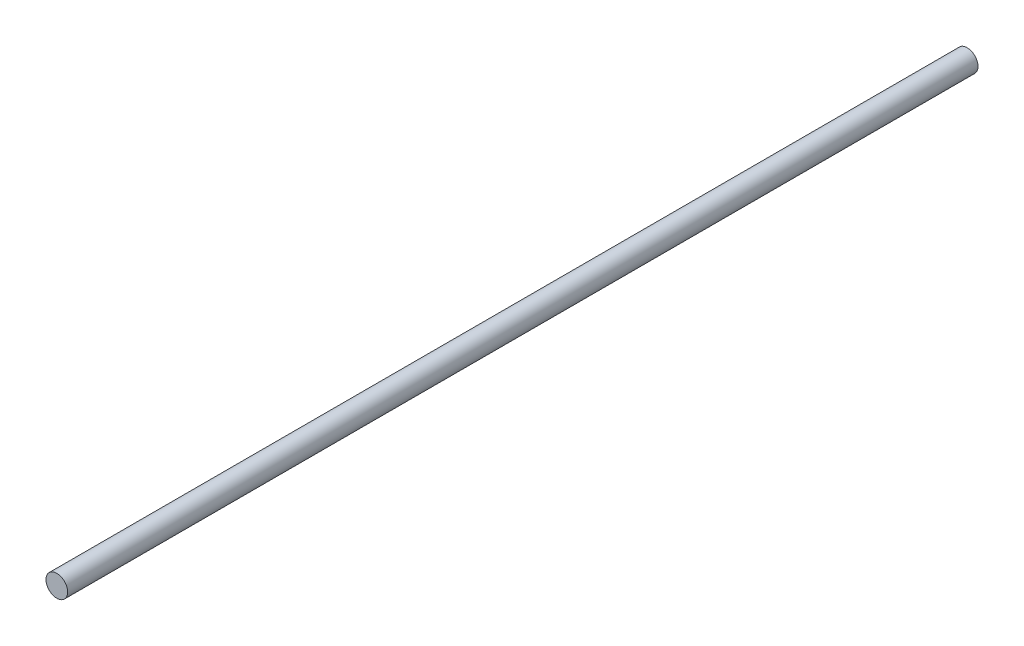
ISO-10303-21;
HEADER;
FILE_DESCRIPTION(('STEP AP214'),'2;1');
FILE_NAME('part.step','',(''),(''),'','','');
FILE_SCHEMA(('AUTOMOTIVE_DESIGN { 1 0 10303 214 1 1 1 1 }'));
ENDSEC;
DATA;
#1=APPLICATION_CONTEXT('core data for automotive mechanical design processes');
#2=APPLICATION_PROTOCOL_DEFINITION('international standard','automotive_design',2000,#1);
#3=PRODUCT_CONTEXT('',#1,'mechanical');
#4=PRODUCT('Part','Part','',(#3));
#5=PRODUCT_RELATED_PRODUCT_CATEGORY('part','',(#4));
#6=PRODUCT_DEFINITION_FORMATION('','',#4);
#7=PRODUCT_DEFINITION_CONTEXT('part definition',#1,'design');
#8=PRODUCT_DEFINITION('design','',#6,#7);
#9=PRODUCT_DEFINITION_SHAPE('','',#8);
#10=(LENGTH_UNIT() NAMED_UNIT(*) SI_UNIT(.MILLI.,.METRE.));
#11=(NAMED_UNIT(*) PLANE_ANGLE_UNIT() SI_UNIT($,.RADIAN.));
#12=(NAMED_UNIT(*) SI_UNIT($,.STERADIAN.) SOLID_ANGLE_UNIT());
#13=UNCERTAINTY_MEASURE_WITH_UNIT(LENGTH_MEASURE(1.E-05),#10,'distance_accuracy_value','');
#14=(GEOMETRIC_REPRESENTATION_CONTEXT(3) GLOBAL_UNCERTAINTY_ASSIGNED_CONTEXT((#13)) GLOBAL_UNIT_ASSIGNED_CONTEXT((#10,
#11,#12)) REPRESENTATION_CONTEXT('',''));
#15=CARTESIAN_POINT('',(0.,0.,0.));
#16=DIRECTION('',(0.,0.,1.));
#17=DIRECTION('',(1.,0.,0.));
#18=AXIS2_PLACEMENT_3D('',#15,#16,#17);
#19=CARTESIAN_POINT('',(0.,0.,373.888));
#20=DIRECTION('',(0.,0.,-1.));
#21=DIRECTION('',(-1.,0.,0.));
#22=AXIS2_PLACEMENT_3D('',#19,#20,#21);
#23=CYLINDRICAL_SURFACE('',#22,4.445);
#24=CARTESIAN_POINT('',(0.,0.,373.888));
#25=DIRECTION('',(0.,0.,1.));
#26=DIRECTION('',(1.,0.,0.));
#27=AXIS2_PLACEMENT_3D('',#24,#25,#26);
#28=CIRCLE('',#27,4.445);
#29=CARTESIAN_POINT('',(4.445,0.,373.888));
#30=VERTEX_POINT('',#29);
#31=EDGE_CURVE('E11',#30,#30,#28,.T.);
#32=ORIENTED_EDGE('',*,*,#31,.F.);
#33=EDGE_LOOP('',(#32));
#34=FACE_BOUND('',#33,.T.);
#35=CARTESIAN_POINT('',(0.,0.,0.));
#36=DIRECTION('',(0.,0.,1.));
#37=DIRECTION('',(1.,0.,0.));
#38=AXIS2_PLACEMENT_3D('',#35,#36,#37);
#39=CIRCLE('',#38,4.445);
#40=CARTESIAN_POINT('',(4.445,0.,0.));
#41=VERTEX_POINT('',#40);
#42=EDGE_CURVE('E51',#41,#41,#39,.T.);
#43=ORIENTED_EDGE('',*,*,#42,.T.);
#44=EDGE_LOOP('',(#43));
#45=FACE_BOUND('',#44,.T.);
#46=ADVANCED_FACE('F48',(#34,#45),#23,.T.);
#47=CARTESIAN_POINT('',(0.,0.,373.888));
#48=DIRECTION('',(0.,0.,1.));
#49=DIRECTION('',(1.,0.,0.));
#50=AXIS2_PLACEMENT_3D('',#47,#48,#49);
#51=PLANE('',#50);
#52=ORIENTED_EDGE('',*,*,#31,.T.);
#53=EDGE_LOOP('',(#52));
#54=FACE_BOUND('',#53,.T.);
#55=ADVANCED_FACE('F70',(#54),#51,.T.);
#56=CARTESIAN_POINT('',(0.,0.,0.));
#57=DIRECTION('',(0.,0.,1.));
#58=DIRECTION('',(1.,0.,0.));
#59=AXIS2_PLACEMENT_3D('',#56,#57,#58);
#60=PLANE('',#59);
#61=ORIENTED_EDGE('',*,*,#42,.F.);
#62=EDGE_LOOP('',(#61));
#63=FACE_BOUND('',#62,.T.);
#64=ADVANCED_FACE('F61',(#63),#60,.F.);
#65=CLOSED_SHELL('',(#46,#55,#64));
#66=MANIFOLD_SOLID_BREP('B2',#65);
#67=ADVANCED_BREP_SHAPE_REPRESENTATION('',(#18,#66),#14);
#68=SHAPE_DEFINITION_REPRESENTATION(#9,#67);
ENDSEC;
END-ISO-10303-21;
